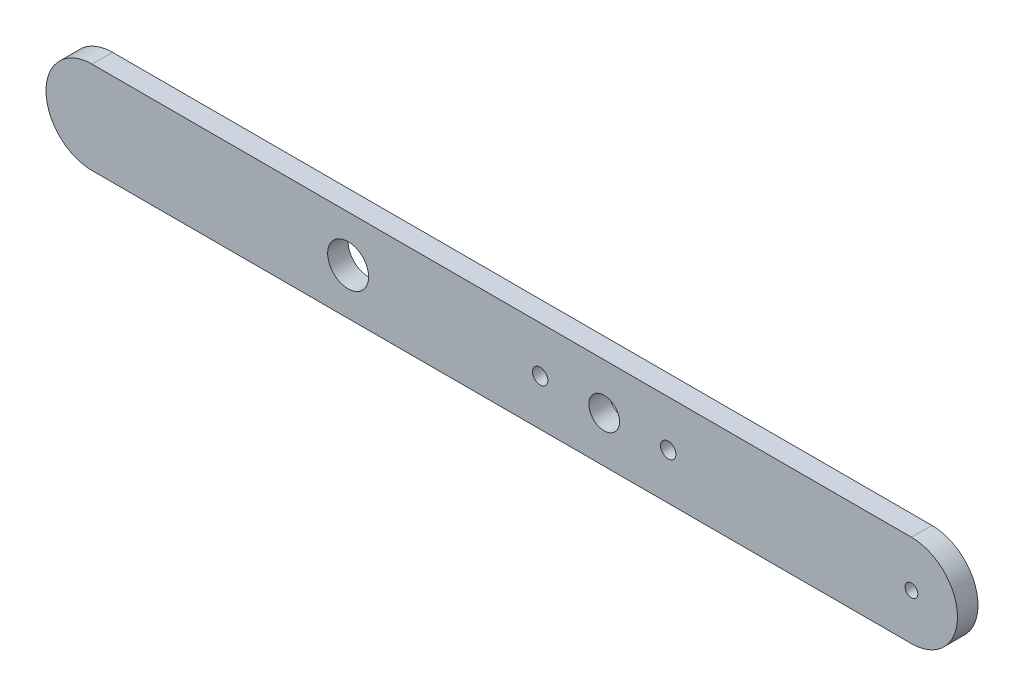
ISO-10303-21;
HEADER;
FILE_DESCRIPTION(('STEP AP214'),'2;1');
FILE_NAME('part.step','',(''),(''),'','','');
FILE_SCHEMA(('AUTOMOTIVE_DESIGN { 1 0 10303 214 1 1 1 1 }'));
ENDSEC;
DATA;
#1=APPLICATION_CONTEXT('core data for automotive mechanical design processes');
#2=APPLICATION_PROTOCOL_DEFINITION('international standard','automotive_design',2000,#1);
#3=PRODUCT_CONTEXT('',#1,'mechanical');
#4=PRODUCT('Part','Part','',(#3));
#5=PRODUCT_RELATED_PRODUCT_CATEGORY('part','',(#4));
#6=PRODUCT_DEFINITION_FORMATION('','',#4);
#7=PRODUCT_DEFINITION_CONTEXT('part definition',#1,'design');
#8=PRODUCT_DEFINITION('design','',#6,#7);
#9=PRODUCT_DEFINITION_SHAPE('','',#8);
#10=(LENGTH_UNIT() NAMED_UNIT(*) SI_UNIT(.MILLI.,.METRE.));
#11=(NAMED_UNIT(*) PLANE_ANGLE_UNIT() SI_UNIT($,.RADIAN.));
#12=(NAMED_UNIT(*) SI_UNIT($,.STERADIAN.) SOLID_ANGLE_UNIT());
#13=UNCERTAINTY_MEASURE_WITH_UNIT(LENGTH_MEASURE(1.E-05),#10,'distance_accuracy_value','');
#14=(GEOMETRIC_REPRESENTATION_CONTEXT(3) GLOBAL_UNCERTAINTY_ASSIGNED_CONTEXT((#13)) GLOBAL_UNIT_ASSIGNED_CONTEXT((#10,
#11,#12)) REPRESENTATION_CONTEXT('',''));
#15=CARTESIAN_POINT('',(0.,0.,0.));
#16=DIRECTION('',(0.,0.,1.));
#17=DIRECTION('',(1.,0.,0.));
#18=AXIS2_PLACEMENT_3D('',#15,#16,#17);
#19=CARTESIAN_POINT('',(0.,0.,4.));
#20=DIRECTION('',(0.,0.,1.));
#21=DIRECTION('',(1.,0.,0.));
#22=AXIS2_PLACEMENT_3D('',#19,#20,#21);
#23=PLANE('',#22);
#24=CARTESIAN_POINT('',(112.5,0.,4.));
#25=DIRECTION('',(0.,0.,1.));
#26=DIRECTION('',(1.,0.,0.));
#27=AXIS2_PLACEMENT_3D('',#24,#25,#26);
#28=CIRCLE('',#27,1.5);
#29=CARTESIAN_POINT('',(114.,0.,4.));
#30=VERTEX_POINT('',#29);
#31=EDGE_CURVE('E138',#30,#30,#28,.T.);
#32=ORIENTED_EDGE('',*,*,#31,.F.);
#33=EDGE_LOOP('',(#32));
#34=FACE_BOUND('',#33,.T.);
#35=CARTESIAN_POINT('',(87.5,0.,4.));
#36=DIRECTION('',(0.,0.,1.));
#37=DIRECTION('',(-1.,0.,0.));
#38=AXIS2_PLACEMENT_3D('',#35,#36,#37);
#39=CIRCLE('',#38,1.5);
#40=CARTESIAN_POINT('',(86.,0.,4.));
#41=VERTEX_POINT('',#40);
#42=EDGE_CURVE('E132',#41,#41,#39,.T.);
#43=ORIENTED_EDGE('',*,*,#42,.F.);
#44=EDGE_LOOP('',(#43));
#45=FACE_BOUND('',#44,.T.);
#46=CARTESIAN_POINT('',(50.,0.,4.));
#47=DIRECTION('',(0.,0.,1.));
#48=DIRECTION('',(1.,0.,0.));
#49=AXIS2_PLACEMENT_3D('',#46,#47,#48);
#50=CIRCLE('',#49,4.00000000000001);
#51=CARTESIAN_POINT('',(54.,0.,4.));
#52=VERTEX_POINT('',#51);
#53=EDGE_CURVE('E117',#52,#52,#50,.T.);
#54=ORIENTED_EDGE('',*,*,#53,.F.);
#55=EDGE_LOOP('',(#54));
#56=FACE_BOUND('',#55,.T.);
#57=CARTESIAN_POINT('',(0.,0.,4.));
#58=DIRECTION('',(0.,0.,1.));
#59=DIRECTION('',(1.,0.,0.));
#60=AXIS2_PLACEMENT_3D('',#57,#58,#59);
#61=CIRCLE('',#60,9.);
#62=CARTESIAN_POINT('',(0.,9.,4.));
#63=VERTEX_POINT('',#62);
#64=CARTESIAN_POINT('',(0.,-9.,4.));
#65=VERTEX_POINT('',#64);
#66=EDGE_CURVE('E87',#63,#65,#61,.T.);
#67=ORIENTED_EDGE('',*,*,#66,.T.);
#68=DIRECTION('',(1.,0.,0.));
#69=VECTOR('',#68,1.);
#70=CARTESIAN_POINT('',(0.,-9.,4.));
#71=LINE('',#70,#69);
#72=CARTESIAN_POINT('',(160.,-9.,4.));
#73=VERTEX_POINT('',#72);
#74=EDGE_CURVE('E82',#65,#73,#71,.T.);
#75=ORIENTED_EDGE('',*,*,#74,.T.);
#76=CARTESIAN_POINT('',(160.,0.,4.));
#77=DIRECTION('',(0.,0.,1.));
#78=DIRECTION('',(1.,0.,0.));
#79=AXIS2_PLACEMENT_3D('',#76,#77,#78);
#80=CIRCLE('',#79,9.);
#81=CARTESIAN_POINT('',(160.,9.,4.));
#82=VERTEX_POINT('',#81);
#83=EDGE_CURVE('E85',#73,#82,#80,.T.);
#84=ORIENTED_EDGE('',*,*,#83,.T.);
#85=DIRECTION('',(-1.,0.,0.));
#86=VECTOR('',#85,1.);
#87=CARTESIAN_POINT('',(0.,9.,4.));
#88=LINE('',#87,#86);
#89=EDGE_CURVE('E52',#82,#63,#88,.T.);
#90=ORIENTED_EDGE('',*,*,#89,.T.);
#91=EDGE_LOOP('',(#67,#75,#84,#90));
#92=FACE_BOUND('',#91,.T.);
#93=CARTESIAN_POINT('',(160.,0.,4.));
#94=DIRECTION('',(0.,0.,1.));
#95=DIRECTION('',(1.,0.,0.));
#96=AXIS2_PLACEMENT_3D('',#93,#94,#95);
#97=CIRCLE('',#96,1.25000000000001);
#98=CARTESIAN_POINT('',(161.25,0.,4.));
#99=VERTEX_POINT('',#98);
#100=EDGE_CURVE('E102',#99,#99,#97,.T.);
#101=ORIENTED_EDGE('',*,*,#100,.F.);
#102=EDGE_LOOP('',(#101));
#103=FACE_BOUND('',#102,.T.);
#104=CARTESIAN_POINT('',(100.,0.,4.));
#105=DIRECTION('',(0.,0.,1.));
#106=DIRECTION('',(1.,0.,0.));
#107=AXIS2_PLACEMENT_3D('',#104,#105,#106);
#108=CIRCLE('',#107,3.00000000000001);
#109=CARTESIAN_POINT('',(103.,0.,4.));
#110=VERTEX_POINT('',#109);
#111=EDGE_CURVE('E123',#110,#110,#108,.T.);
#112=ORIENTED_EDGE('',*,*,#111,.F.);
#113=EDGE_LOOP('',(#112));
#114=FACE_BOUND('',#113,.T.);
#115=ADVANCED_FACE('F35',(#34,#45,#56,#92,#103,#114),#23,.T.);
#116=CARTESIAN_POINT('',(0.,0.,0.));
#117=DIRECTION('',(0.,0.,1.));
#118=DIRECTION('',(1.,0.,0.));
#119=AXIS2_PLACEMENT_3D('',#116,#117,#118);
#120=PLANE('',#119);
#121=CARTESIAN_POINT('',(112.5,0.,0.));
#122=DIRECTION('',(0.,0.,1.));
#123=DIRECTION('',(1.,0.,0.));
#124=AXIS2_PLACEMENT_3D('',#121,#122,#123);
#125=CIRCLE('',#124,1.5);
#126=CARTESIAN_POINT('',(114.,0.,0.));
#127=VERTEX_POINT('',#126);
#128=EDGE_CURVE('E129',#127,#127,#125,.T.);
#129=ORIENTED_EDGE('',*,*,#128,.T.);
#130=EDGE_LOOP('',(#129));
#131=FACE_BOUND('',#130,.T.);
#132=CARTESIAN_POINT('',(87.5,0.,0.));
#133=DIRECTION('',(0.,0.,1.));
#134=DIRECTION('',(-1.,0.,0.));
#135=AXIS2_PLACEMENT_3D('',#132,#133,#134);
#136=CIRCLE('',#135,1.5);
#137=CARTESIAN_POINT('',(86.,0.,0.));
#138=VERTEX_POINT('',#137);
#139=EDGE_CURVE('E135',#138,#138,#136,.T.);
#140=ORIENTED_EDGE('',*,*,#139,.T.);
#141=EDGE_LOOP('',(#140));
#142=FACE_BOUND('',#141,.T.);
#143=CARTESIAN_POINT('',(0.,0.,0.));
#144=DIRECTION('',(0.,0.,1.));
#145=DIRECTION('',(1.,0.,0.));
#146=AXIS2_PLACEMENT_3D('',#143,#144,#145);
#147=CIRCLE('',#146,9.);
#148=CARTESIAN_POINT('',(0.,9.,0.));
#149=VERTEX_POINT('',#148);
#150=CARTESIAN_POINT('',(0.,-9.,0.));
#151=VERTEX_POINT('',#150);
#152=EDGE_CURVE('E99',#149,#151,#147,.T.);
#153=ORIENTED_EDGE('',*,*,#152,.F.);
#154=DIRECTION('',(-1.,0.,0.));
#155=VECTOR('',#154,1.);
#156=CARTESIAN_POINT('',(0.,9.,0.));
#157=LINE('',#156,#155);
#158=CARTESIAN_POINT('',(160.,9.,0.));
#159=VERTEX_POINT('',#158);
#160=EDGE_CURVE('E75',#159,#149,#157,.T.);
#161=ORIENTED_EDGE('',*,*,#160,.F.);
#162=CARTESIAN_POINT('',(160.,0.,0.));
#163=DIRECTION('',(0.,0.,1.));
#164=DIRECTION('',(1.,0.,0.));
#165=AXIS2_PLACEMENT_3D('',#162,#163,#164);
#166=CIRCLE('',#165,9.);
#167=CARTESIAN_POINT('',(160.,-9.,0.));
#168=VERTEX_POINT('',#167);
#169=EDGE_CURVE('E69',#168,#159,#166,.T.);
#170=ORIENTED_EDGE('',*,*,#169,.F.);
#171=DIRECTION('',(1.,0.,0.));
#172=VECTOR('',#171,1.);
#173=CARTESIAN_POINT('',(0.,-9.,0.));
#174=LINE('',#173,#172);
#175=EDGE_CURVE('E91',#151,#168,#174,.T.);
#176=ORIENTED_EDGE('',*,*,#175,.F.);
#177=EDGE_LOOP('',(#153,#161,#170,#176));
#178=FACE_BOUND('',#177,.T.);
#179=CARTESIAN_POINT('',(160.,0.,0.));
#180=DIRECTION('',(0.,0.,1.));
#181=DIRECTION('',(1.,0.,0.));
#182=AXIS2_PLACEMENT_3D('',#179,#180,#181);
#183=CIRCLE('',#182,1.25000000000001);
#184=CARTESIAN_POINT('',(161.25,0.,0.));
#185=VERTEX_POINT('',#184);
#186=EDGE_CURVE('E114',#185,#185,#183,.T.);
#187=ORIENTED_EDGE('',*,*,#186,.T.);
#188=EDGE_LOOP('',(#187));
#189=FACE_BOUND('',#188,.T.);
#190=CARTESIAN_POINT('',(50.,0.,0.));
#191=DIRECTION('',(0.,0.,1.));
#192=DIRECTION('',(1.,0.,0.));
#193=AXIS2_PLACEMENT_3D('',#190,#191,#192);
#194=CIRCLE('',#193,4.00000000000001);
#195=CARTESIAN_POINT('',(54.,0.,0.));
#196=VERTEX_POINT('',#195);
#197=EDGE_CURVE('E120',#196,#196,#194,.T.);
#198=ORIENTED_EDGE('',*,*,#197,.T.);
#199=EDGE_LOOP('',(#198));
#200=FACE_BOUND('',#199,.T.);
#201=CARTESIAN_POINT('',(100.,0.,0.));
#202=DIRECTION('',(0.,0.,1.));
#203=DIRECTION('',(1.,0.,0.));
#204=AXIS2_PLACEMENT_3D('',#201,#202,#203);
#205=CIRCLE('',#204,3.00000000000001);
#206=CARTESIAN_POINT('',(103.,0.,0.));
#207=VERTEX_POINT('',#206);
#208=EDGE_CURVE('E126',#207,#207,#205,.T.);
#209=ORIENTED_EDGE('',*,*,#208,.T.);
#210=EDGE_LOOP('',(#209));
#211=FACE_BOUND('',#210,.T.);
#212=ADVANCED_FACE('F110',(#131,#142,#178,#189,#200,#211),#120,.F.);
#213=CARTESIAN_POINT('',(0.,0.,4.));
#214=DIRECTION('',(0.,0.,-1.));
#215=DIRECTION('',(-1.,0.,0.));
#216=AXIS2_PLACEMENT_3D('',#213,#214,#215);
#217=CYLINDRICAL_SURFACE('',#216,9.);
#218=ORIENTED_EDGE('',*,*,#152,.T.);
#219=DIRECTION('',(0.,0.,-1.));
#220=VECTOR('',#219,1.);
#221=CARTESIAN_POINT('',(0.,-9.,4.));
#222=LINE('',#221,#220);
#223=EDGE_CURVE('E11',#65,#151,#222,.T.);
#224=ORIENTED_EDGE('',*,*,#223,.F.);
#225=ORIENTED_EDGE('',*,*,#66,.F.);
#226=DIRECTION('',(0.,0.,-1.));
#227=VECTOR('',#226,1.);
#228=CARTESIAN_POINT('',(0.,9.,4.));
#229=LINE('',#228,#227);
#230=EDGE_CURVE('E95',#63,#149,#229,.T.);
#231=ORIENTED_EDGE('',*,*,#230,.T.);
#232=EDGE_LOOP('',(#218,#224,#225,#231));
#233=FACE_BOUND('',#232,.T.);
#234=ADVANCED_FACE('F37',(#233),#217,.T.);
#235=CARTESIAN_POINT('',(0.,-9.,4.));
#236=DIRECTION('',(0.,1.,0.));
#237=DIRECTION('',(0.,0.,1.));
#238=AXIS2_PLACEMENT_3D('',#235,#236,#237);
#239=PLANE('',#238);
#240=ORIENTED_EDGE('',*,*,#175,.T.);
#241=DIRECTION('',(0.,0.,-1.));
#242=VECTOR('',#241,1.);
#243=CARTESIAN_POINT('',(160.,-9.,4.));
#244=LINE('',#243,#242);
#245=EDGE_CURVE('E44',#73,#168,#244,.T.);
#246=ORIENTED_EDGE('',*,*,#245,.F.);
#247=ORIENTED_EDGE('',*,*,#74,.F.);
#248=ORIENTED_EDGE('',*,*,#223,.T.);
#249=EDGE_LOOP('',(#240,#246,#247,#248));
#250=FACE_BOUND('',#249,.T.);
#251=ADVANCED_FACE('F90',(#250),#239,.F.);
#252=CARTESIAN_POINT('',(160.,0.,4.));
#253=DIRECTION('',(0.,0.,-1.));
#254=DIRECTION('',(-1.,0.,0.));
#255=AXIS2_PLACEMENT_3D('',#252,#253,#254);
#256=CYLINDRICAL_SURFACE('',#255,9.);
#257=ORIENTED_EDGE('',*,*,#169,.T.);
#258=DIRECTION('',(0.,0.,-1.));
#259=VECTOR('',#258,1.);
#260=CARTESIAN_POINT('',(160.,9.,4.));
#261=LINE('',#260,#259);
#262=EDGE_CURVE('E92',#82,#159,#261,.T.);
#263=ORIENTED_EDGE('',*,*,#262,.F.);
#264=ORIENTED_EDGE('',*,*,#83,.F.);
#265=ORIENTED_EDGE('',*,*,#245,.T.);
#266=EDGE_LOOP('',(#257,#263,#264,#265));
#267=FACE_BOUND('',#266,.T.);
#268=ADVANCED_FACE('F93',(#267),#256,.T.);
#269=CARTESIAN_POINT('',(0.,9.,4.));
#270=DIRECTION('',(0.,-1.,0.));
#271=DIRECTION('',(0.,0.,-1.));
#272=AXIS2_PLACEMENT_3D('',#269,#270,#271);
#273=PLANE('',#272);
#274=ORIENTED_EDGE('',*,*,#160,.T.);
#275=ORIENTED_EDGE('',*,*,#230,.F.);
#276=ORIENTED_EDGE('',*,*,#89,.F.);
#277=ORIENTED_EDGE('',*,*,#262,.T.);
#278=EDGE_LOOP('',(#274,#275,#276,#277));
#279=FACE_BOUND('',#278,.T.);
#280=ADVANCED_FACE('F107',(#279),#273,.F.);
#281=CARTESIAN_POINT('',(160.,0.,4.));
#282=DIRECTION('',(0.,0.,-1.));
#283=DIRECTION('',(-1.,0.,0.));
#284=AXIS2_PLACEMENT_3D('',#281,#282,#283);
#285=CYLINDRICAL_SURFACE('',#284,1.25000000000001);
#286=ORIENTED_EDGE('',*,*,#100,.T.);
#287=EDGE_LOOP('',(#286));
#288=FACE_BOUND('',#287,.T.);
#289=ORIENTED_EDGE('',*,*,#186,.F.);
#290=EDGE_LOOP('',(#289));
#291=FACE_BOUND('',#290,.T.);
#292=ADVANCED_FACE('F164',(#288,#291),#285,.F.);
#293=CARTESIAN_POINT('',(50.,0.,4.));
#294=DIRECTION('',(0.,0.,-1.));
#295=DIRECTION('',(-1.,0.,0.));
#296=AXIS2_PLACEMENT_3D('',#293,#294,#295);
#297=CYLINDRICAL_SURFACE('',#296,4.00000000000001);
#298=ORIENTED_EDGE('',*,*,#53,.T.);
#299=EDGE_LOOP('',(#298));
#300=FACE_BOUND('',#299,.T.);
#301=ORIENTED_EDGE('',*,*,#197,.F.);
#302=EDGE_LOOP('',(#301));
#303=FACE_BOUND('',#302,.T.);
#304=ADVANCED_FACE('F160',(#300,#303),#297,.F.);
#305=CARTESIAN_POINT('',(100.,0.,4.));
#306=DIRECTION('',(0.,0.,-1.));
#307=DIRECTION('',(-1.,0.,0.));
#308=AXIS2_PLACEMENT_3D('',#305,#306,#307);
#309=CYLINDRICAL_SURFACE('',#308,3.00000000000001);
#310=ORIENTED_EDGE('',*,*,#111,.T.);
#311=EDGE_LOOP('',(#310));
#312=FACE_BOUND('',#311,.T.);
#313=ORIENTED_EDGE('',*,*,#208,.F.);
#314=EDGE_LOOP('',(#313));
#315=FACE_BOUND('',#314,.T.);
#316=ADVANCED_FACE('F163',(#312,#315),#309,.F.);
#317=CARTESIAN_POINT('',(87.5,0.,0.));
#318=DIRECTION('',(0.,0.,1.));
#319=DIRECTION('',(1.,0.,0.));
#320=AXIS2_PLACEMENT_3D('',#317,#318,#319);
#321=CYLINDRICAL_SURFACE('',#320,1.5);
#322=ORIENTED_EDGE('',*,*,#139,.F.);
#323=EDGE_LOOP('',(#322));
#324=FACE_BOUND('',#323,.T.);
#325=ORIENTED_EDGE('',*,*,#42,.T.);
#326=EDGE_LOOP('',(#325));
#327=FACE_BOUND('',#326,.T.);
#328=ADVANCED_FACE('F149',(#324,#327),#321,.F.);
#329=CARTESIAN_POINT('',(112.5,0.,0.));
#330=DIRECTION('',(0.,0.,1.));
#331=DIRECTION('',(1.,0.,0.));
#332=AXIS2_PLACEMENT_3D('',#329,#330,#331);
#333=CYLINDRICAL_SURFACE('',#332,1.5);
#334=ORIENTED_EDGE('',*,*,#128,.F.);
#335=EDGE_LOOP('',(#334));
#336=FACE_BOUND('',#335,.T.);
#337=ORIENTED_EDGE('',*,*,#31,.T.);
#338=EDGE_LOOP('',(#337));
#339=FACE_BOUND('',#338,.T.);
#340=ADVANCED_FACE('F146',(#336,#339),#333,.F.);
#341=CLOSED_SHELL('',(#115,#212,#234,#251,#268,#280,#292,#304,#316,#328,#340));
#342=MANIFOLD_SOLID_BREP('B2',#341);
#343=ADVANCED_BREP_SHAPE_REPRESENTATION('',(#18,#342),#14);
#344=SHAPE_DEFINITION_REPRESENTATION(#9,#343);
ENDSEC;
END-ISO-10303-21;
